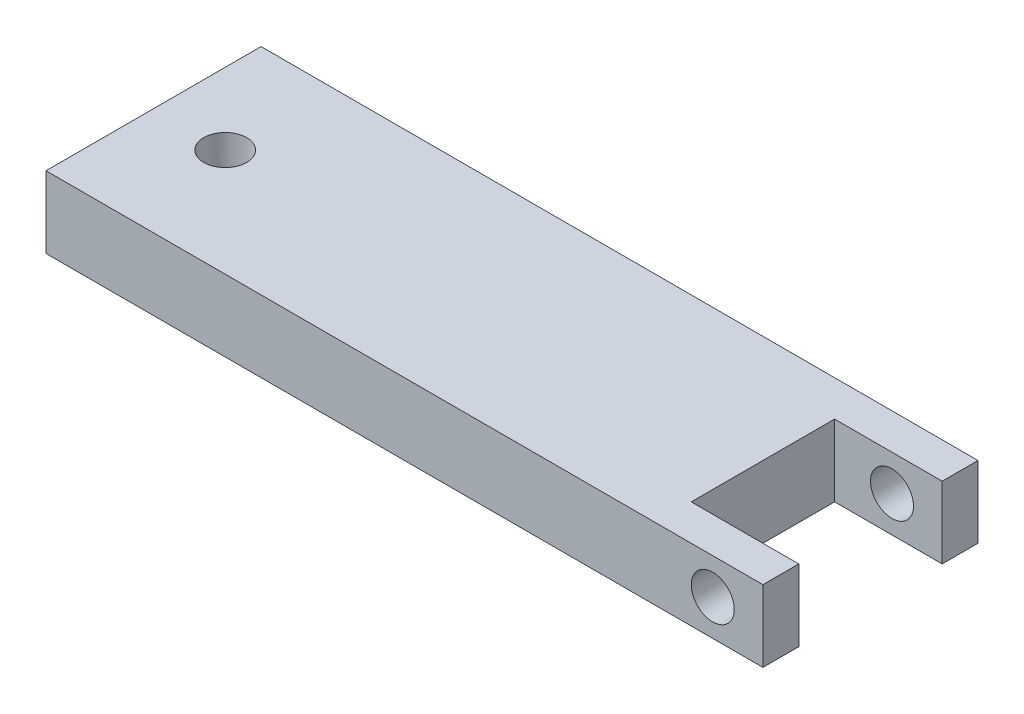
ISO-10303-21;
HEADER;
FILE_DESCRIPTION(('STEP AP214'),'2;1');
FILE_NAME('part.step','',(''),(''),'','','');
FILE_SCHEMA(('AUTOMOTIVE_DESIGN { 1 0 10303 214 1 1 1 1 }'));
ENDSEC;
DATA;
#1=APPLICATION_CONTEXT('core data for automotive mechanical design processes');
#2=APPLICATION_PROTOCOL_DEFINITION('international standard','automotive_design',2000,#1);
#3=PRODUCT_CONTEXT('',#1,'mechanical');
#4=PRODUCT('Part','Part','',(#3));
#5=PRODUCT_RELATED_PRODUCT_CATEGORY('part','',(#4));
#6=PRODUCT_DEFINITION_FORMATION('','',#4);
#7=PRODUCT_DEFINITION_CONTEXT('part definition',#1,'design');
#8=PRODUCT_DEFINITION('design','',#6,#7);
#9=PRODUCT_DEFINITION_SHAPE('','',#8);
#10=(LENGTH_UNIT() NAMED_UNIT(*) SI_UNIT(.MILLI.,.METRE.));
#11=(NAMED_UNIT(*) PLANE_ANGLE_UNIT() SI_UNIT($,.RADIAN.));
#12=(NAMED_UNIT(*) SI_UNIT($,.STERADIAN.) SOLID_ANGLE_UNIT());
#13=UNCERTAINTY_MEASURE_WITH_UNIT(LENGTH_MEASURE(1.E-05),#10,'distance_accuracy_value','');
#14=(GEOMETRIC_REPRESENTATION_CONTEXT(3) GLOBAL_UNCERTAINTY_ASSIGNED_CONTEXT((#13)) GLOBAL_UNIT_ASSIGNED_CONTEXT((#10,
#11,#12)) REPRESENTATION_CONTEXT('',''));
#15=CARTESIAN_POINT('',(0.,0.,0.));
#16=DIRECTION('',(0.,0.,1.));
#17=DIRECTION('',(1.,0.,0.));
#18=AXIS2_PLACEMENT_3D('',#15,#16,#17);
#19=CARTESIAN_POINT('',(50.,5.,0.));
#20=DIRECTION('',(-1.,0.,0.));
#21=DIRECTION('',(0.,0.,1.));
#22=AXIS2_PLACEMENT_3D('',#19,#20,#21);
#23=PLANE('',#22);
#24=DIRECTION('',(0.,0.,-1.));
#25=VECTOR('',#24,1.);
#26=CARTESIAN_POINT('',(50.,0.,0.));
#27=LINE('',#26,#25);
#28=CARTESIAN_POINT('',(50.,0.,0.));
#29=VERTEX_POINT('',#28);
#30=CARTESIAN_POINT('',(50.,0.,-2.5));
#31=VERTEX_POINT('',#30);
#32=EDGE_CURVE('E155',#29,#31,#27,.T.);
#33=ORIENTED_EDGE('',*,*,#32,.T.);
#34=DIRECTION('',(0.,-1.,0.));
#35=VECTOR('',#34,1.);
#36=CARTESIAN_POINT('',(50.,5.,-2.5));
#37=LINE('',#36,#35);
#38=CARTESIAN_POINT('',(50.,5.,-2.5));
#39=VERTEX_POINT('',#38);
#40=EDGE_CURVE('E170',#39,#31,#37,.T.);
#41=ORIENTED_EDGE('',*,*,#40,.F.);
#42=DIRECTION('',(0.,0.,-1.));
#43=VECTOR('',#42,1.);
#44=CARTESIAN_POINT('',(50.,5.,0.));
#45=LINE('',#44,#43);
#46=CARTESIAN_POINT('',(50.,5.,0.));
#47=VERTEX_POINT('',#46);
#48=EDGE_CURVE('E146',#47,#39,#45,.T.);
#49=ORIENTED_EDGE('',*,*,#48,.F.);
#50=DIRECTION('',(0.,-1.,0.));
#51=VECTOR('',#50,1.);
#52=CARTESIAN_POINT('',(50.,5.,0.));
#53=LINE('',#52,#51);
#54=EDGE_CURVE('E42',#47,#29,#53,.T.);
#55=ORIENTED_EDGE('',*,*,#54,.T.);
#56=EDGE_LOOP('',(#33,#41,#49,#55));
#57=FACE_BOUND('',#56,.T.);
#58=ADVANCED_FACE('F33',(#57),#23,.F.);
#59=CARTESIAN_POINT('',(0.,5.,0.));
#60=DIRECTION('',(1.,0.,0.));
#61=DIRECTION('',(0.,0.,-1.));
#62=AXIS2_PLACEMENT_3D('',#59,#60,#61);
#63=PLANE('',#62);
#64=DIRECTION('',(0.,0.,1.));
#65=VECTOR('',#64,1.);
#66=CARTESIAN_POINT('',(0.,0.,0.));
#67=LINE('',#66,#65);
#68=CARTESIAN_POINT('',(0.,0.,-15.));
#69=VERTEX_POINT('',#68);
#70=CARTESIAN_POINT('',(0.,0.,0.));
#71=VERTEX_POINT('',#70);
#72=EDGE_CURVE('E141',#69,#71,#67,.T.);
#73=ORIENTED_EDGE('',*,*,#72,.T.);
#74=DIRECTION('',(0.,-1.,0.));
#75=VECTOR('',#74,1.);
#76=CARTESIAN_POINT('',(0.,5.,0.));
#77=LINE('',#76,#75);
#78=CARTESIAN_POINT('',(0.,5.,0.));
#79=VERTEX_POINT('',#78);
#80=EDGE_CURVE('E11',#79,#71,#77,.T.);
#81=ORIENTED_EDGE('',*,*,#80,.F.);
#82=DIRECTION('',(0.,0.,1.));
#83=VECTOR('',#82,1.);
#84=CARTESIAN_POINT('',(0.,5.,0.));
#85=LINE('',#84,#83);
#86=CARTESIAN_POINT('',(0.,5.,-15.));
#87=VERTEX_POINT('',#86);
#88=EDGE_CURVE('E142',#87,#79,#85,.T.);
#89=ORIENTED_EDGE('',*,*,#88,.F.);
#90=DIRECTION('',(0.,-1.,0.));
#91=VECTOR('',#90,1.);
#92=CARTESIAN_POINT('',(0.,5.,-15.));
#93=LINE('',#92,#91);
#94=EDGE_CURVE('E150',#87,#69,#93,.T.);
#95=ORIENTED_EDGE('',*,*,#94,.T.);
#96=EDGE_LOOP('',(#73,#81,#89,#95));
#97=FACE_BOUND('',#96,.T.);
#98=ADVANCED_FACE('F35',(#97),#63,.F.);
#99=CARTESIAN_POINT('',(0.,5.,0.));
#100=DIRECTION('',(0.,0.,-1.));
#101=DIRECTION('',(-1.,0.,0.));
#102=AXIS2_PLACEMENT_3D('',#99,#100,#101);
#103=PLANE('',#102);
#104=CARTESIAN_POINT('',(46.5,2.5,0.));
#105=DIRECTION('',(0.,0.,-1.));
#106=DIRECTION('',(-1.,0.,0.));
#107=AXIS2_PLACEMENT_3D('',#104,#105,#106);
#108=CIRCLE('',#107,1.5);
#109=CARTESIAN_POINT('',(45.,2.5,0.));
#110=VERTEX_POINT('',#109);
#111=EDGE_CURVE('E184',#110,#110,#108,.T.);
#112=ORIENTED_EDGE('',*,*,#111,.T.);
#113=EDGE_LOOP('',(#112));
#114=FACE_BOUND('',#113,.T.);
#115=DIRECTION('',(1.,0.,0.));
#116=VECTOR('',#115,1.);
#117=CARTESIAN_POINT('',(0.,0.,0.));
#118=LINE('',#117,#116);
#119=EDGE_CURVE('E153',#71,#29,#118,.T.);
#120=ORIENTED_EDGE('',*,*,#119,.T.);
#121=ORIENTED_EDGE('',*,*,#54,.F.);
#122=DIRECTION('',(1.,0.,0.));
#123=VECTOR('',#122,1.);
#124=CARTESIAN_POINT('',(0.,5.,0.));
#125=LINE('',#124,#123);
#126=EDGE_CURVE('E86',#79,#47,#125,.T.);
#127=ORIENTED_EDGE('',*,*,#126,.F.);
#128=ORIENTED_EDGE('',*,*,#80,.T.);
#129=EDGE_LOOP('',(#120,#121,#127,#128));
#130=FACE_BOUND('',#129,.T.);
#131=ADVANCED_FACE('F209',(#114,#130),#103,.F.);
#132=CARTESIAN_POINT('',(50.,5.,-12.5));
#133=VERTEX_POINT('',#132);
#134=CARTESIAN_POINT('',(50.,5.,-15.));
#135=VERTEX_POINT('',#134);
#136=EDGE_CURVE('E145',#133,#135,#45,.T.);
#137=ORIENTED_EDGE('',*,*,#136,.F.);
#138=DIRECTION('',(0.,1.,0.));
#139=VECTOR('',#138,1.);
#140=CARTESIAN_POINT('',(50.,5.,-12.5));
#141=LINE('',#140,#139);
#142=CARTESIAN_POINT('',(50.,0.,-12.5));
#143=VERTEX_POINT('',#142);
#144=EDGE_CURVE('E172',#143,#133,#141,.T.);
#145=ORIENTED_EDGE('',*,*,#144,.F.);
#146=CARTESIAN_POINT('',(50.,0.,-15.));
#147=VERTEX_POINT('',#146);
#148=EDGE_CURVE('E127',#143,#147,#27,.T.);
#149=ORIENTED_EDGE('',*,*,#148,.T.);
#150=DIRECTION('',(0.,-1.,0.));
#151=VECTOR('',#150,1.);
#152=CARTESIAN_POINT('',(50.,5.,-15.));
#153=LINE('',#152,#151);
#154=EDGE_CURVE('E160',#135,#147,#153,.T.);
#155=ORIENTED_EDGE('',*,*,#154,.F.);
#156=EDGE_LOOP('',(#137,#145,#149,#155));
#157=FACE_BOUND('',#156,.T.);
#158=ADVANCED_FACE('F202',(#157),#23,.F.);
#159=CARTESIAN_POINT('',(0.,5.,-15.));
#160=DIRECTION('',(0.,0.,1.));
#161=DIRECTION('',(1.,0.,0.));
#162=AXIS2_PLACEMENT_3D('',#159,#160,#161);
#163=PLANE('',#162);
#164=CARTESIAN_POINT('',(46.5,2.5,-15.));
#165=DIRECTION('',(0.,0.,1.));
#166=DIRECTION('',(1.,0.,0.));
#167=AXIS2_PLACEMENT_3D('',#164,#165,#166);
#168=CIRCLE('',#167,1.5);
#169=CARTESIAN_POINT('',(48.,2.5,-15.));
#170=VERTEX_POINT('',#169);
#171=EDGE_CURVE('E173',#170,#170,#168,.T.);
#172=ORIENTED_EDGE('',*,*,#171,.T.);
#173=EDGE_LOOP('',(#172));
#174=FACE_BOUND('',#173,.T.);
#175=DIRECTION('',(-1.,0.,0.));
#176=VECTOR('',#175,1.);
#177=CARTESIAN_POINT('',(0.,0.,-15.));
#178=LINE('',#177,#176);
#179=EDGE_CURVE('E79',#147,#69,#178,.T.);
#180=ORIENTED_EDGE('',*,*,#179,.T.);
#181=ORIENTED_EDGE('',*,*,#94,.F.);
#182=DIRECTION('',(-1.,0.,0.));
#183=VECTOR('',#182,1.);
#184=CARTESIAN_POINT('',(0.,5.,-15.));
#185=LINE('',#184,#183);
#186=EDGE_CURVE('E58',#135,#87,#185,.T.);
#187=ORIENTED_EDGE('',*,*,#186,.F.);
#188=ORIENTED_EDGE('',*,*,#154,.T.);
#189=EDGE_LOOP('',(#180,#181,#187,#188));
#190=FACE_BOUND('',#189,.T.);
#191=ADVANCED_FACE('F199',(#174,#190),#163,.F.);
#192=CARTESIAN_POINT('',(0.,5.,0.));
#193=DIRECTION('',(0.,-1.,0.));
#194=DIRECTION('',(0.,0.,-1.));
#195=AXIS2_PLACEMENT_3D('',#192,#193,#194);
#196=PLANE('',#195);
#197=ORIENTED_EDGE('',*,*,#48,.T.);
#198=DIRECTION('',(1.,0.,0.));
#199=VECTOR('',#198,1.);
#200=CARTESIAN_POINT('',(42.5,5.,-2.5));
#201=LINE('',#200,#199);
#202=CARTESIAN_POINT('',(42.5,5.,-2.5));
#203=VERTEX_POINT('',#202);
#204=EDGE_CURVE('E130',#203,#39,#201,.T.);
#205=ORIENTED_EDGE('',*,*,#204,.F.);
#206=DIRECTION('',(0.,0.,1.));
#207=VECTOR('',#206,1.);
#208=CARTESIAN_POINT('',(42.5,5.,-2.5));
#209=LINE('',#208,#207);
#210=CARTESIAN_POINT('',(42.5,5.,-12.5));
#211=VERTEX_POINT('',#210);
#212=EDGE_CURVE('E116',#211,#203,#209,.T.);
#213=ORIENTED_EDGE('',*,*,#212,.F.);
#214=DIRECTION('',(1.,0.,0.));
#215=VECTOR('',#214,1.);
#216=CARTESIAN_POINT('',(42.5,5.,-12.5));
#217=LINE('',#216,#215);
#218=EDGE_CURVE('E114',#211,#133,#217,.T.);
#219=ORIENTED_EDGE('',*,*,#218,.T.);
#220=ORIENTED_EDGE('',*,*,#136,.T.);
#221=ORIENTED_EDGE('',*,*,#186,.T.);
#222=ORIENTED_EDGE('',*,*,#88,.T.);
#223=ORIENTED_EDGE('',*,*,#126,.T.);
#224=EDGE_LOOP('',(#197,#205,#213,#219,#220,#221,#222,#223));
#225=FACE_BOUND('',#224,.T.);
#226=CARTESIAN_POINT('',(5.,5.,-7.5));
#227=DIRECTION('',(0.,-1.,0.));
#228=DIRECTION('',(0.,0.,-1.));
#229=AXIS2_PLACEMENT_3D('',#226,#227,#228);
#230=CIRCLE('',#229,1.5);
#231=CARTESIAN_POINT('',(5.,5.,-9.));
#232=VERTEX_POINT('',#231);
#233=EDGE_CURVE('E138',#232,#232,#230,.T.);
#234=ORIENTED_EDGE('',*,*,#233,.T.);
#235=EDGE_LOOP('',(#234));
#236=FACE_BOUND('',#235,.T.);
#237=ADVANCED_FACE('F201',(#225,#236),#196,.F.);
#238=CARTESIAN_POINT('',(0.,0.,0.));
#239=DIRECTION('',(0.,-1.,0.));
#240=DIRECTION('',(0.,0.,-1.));
#241=AXIS2_PLACEMENT_3D('',#238,#239,#240);
#242=PLANE('',#241);
#243=DIRECTION('',(1.,0.,0.));
#244=VECTOR('',#243,1.);
#245=CARTESIAN_POINT('',(42.5,0.,-2.5));
#246=LINE('',#245,#244);
#247=CARTESIAN_POINT('',(42.5,0.,-2.5));
#248=VERTEX_POINT('',#247);
#249=EDGE_CURVE('E128',#248,#31,#246,.T.);
#250=ORIENTED_EDGE('',*,*,#249,.T.);
#251=ORIENTED_EDGE('',*,*,#32,.F.);
#252=ORIENTED_EDGE('',*,*,#119,.F.);
#253=ORIENTED_EDGE('',*,*,#72,.F.);
#254=ORIENTED_EDGE('',*,*,#179,.F.);
#255=ORIENTED_EDGE('',*,*,#148,.F.);
#256=DIRECTION('',(1.,0.,0.));
#257=VECTOR('',#256,1.);
#258=CARTESIAN_POINT('',(42.5,0.,-12.5));
#259=LINE('',#258,#257);
#260=CARTESIAN_POINT('',(42.5,0.,-12.5));
#261=VERTEX_POINT('',#260);
#262=EDGE_CURVE('E111',#261,#143,#259,.T.);
#263=ORIENTED_EDGE('',*,*,#262,.F.);
#264=DIRECTION('',(0.,0.,-1.));
#265=VECTOR('',#264,1.);
#266=CARTESIAN_POINT('',(42.5,0.,-2.5));
#267=LINE('',#266,#265);
#268=EDGE_CURVE('E117',#248,#261,#267,.T.);
#269=ORIENTED_EDGE('',*,*,#268,.F.);
#270=EDGE_LOOP('',(#250,#251,#252,#253,#254,#255,#263,#269));
#271=FACE_BOUND('',#270,.T.);
#272=CARTESIAN_POINT('',(5.,0.,-7.5));
#273=DIRECTION('',(0.,1.,0.));
#274=DIRECTION('',(0.,0.,1.));
#275=AXIS2_PLACEMENT_3D('',#272,#273,#274);
#276=CIRCLE('',#275,1.5);
#277=CARTESIAN_POINT('',(5.,0.,-6.));
#278=VERTEX_POINT('',#277);
#279=EDGE_CURVE('E135',#278,#278,#276,.T.);
#280=ORIENTED_EDGE('',*,*,#279,.T.);
#281=EDGE_LOOP('',(#280));
#282=FACE_BOUND('',#281,.T.);
#283=ADVANCED_FACE('F125',(#271,#282),#242,.T.);
#284=CARTESIAN_POINT('',(5.,0.,-7.5));
#285=DIRECTION('',(0.,1.,0.));
#286=DIRECTION('',(0.,0.,1.));
#287=AXIS2_PLACEMENT_3D('',#284,#285,#286);
#288=CYLINDRICAL_SURFACE('',#287,1.5);
#289=ORIENTED_EDGE('',*,*,#279,.F.);
#290=EDGE_LOOP('',(#289));
#291=FACE_BOUND('',#290,.T.);
#292=ORIENTED_EDGE('',*,*,#233,.F.);
#293=EDGE_LOOP('',(#292));
#294=FACE_BOUND('',#293,.T.);
#295=ADVANCED_FACE('F228',(#291,#294),#288,.F.);
#296=CARTESIAN_POINT('',(42.5,5.,-2.5));
#297=DIRECTION('',(0.,0.,1.));
#298=DIRECTION('',(0.,-1.,0.));
#299=AXIS2_PLACEMENT_3D('',#296,#297,#298);
#300=PLANE('',#299);
#301=CARTESIAN_POINT('',(46.5,2.5,-2.5));
#302=DIRECTION('',(0.,0.,1.));
#303=DIRECTION('',(0.,-1.,0.));
#304=AXIS2_PLACEMENT_3D('',#301,#302,#303);
#305=CIRCLE('',#304,1.5);
#306=CARTESIAN_POINT('',(46.5,1.,-2.5));
#307=VERTEX_POINT('',#306);
#308=EDGE_CURVE('E177',#307,#307,#305,.T.);
#309=ORIENTED_EDGE('',*,*,#308,.T.);
#310=EDGE_LOOP('',(#309));
#311=FACE_BOUND('',#310,.T.);
#312=ORIENTED_EDGE('',*,*,#40,.T.);
#313=ORIENTED_EDGE('',*,*,#249,.F.);
#314=DIRECTION('',(0.,-1.,0.));
#315=VECTOR('',#314,1.);
#316=CARTESIAN_POINT('',(42.5,5.,-2.5));
#317=LINE('',#316,#315);
#318=EDGE_CURVE('E49',#203,#248,#317,.T.);
#319=ORIENTED_EDGE('',*,*,#318,.F.);
#320=ORIENTED_EDGE('',*,*,#204,.T.);
#321=EDGE_LOOP('',(#312,#313,#319,#320));
#322=FACE_BOUND('',#321,.T.);
#323=ADVANCED_FACE('F169',(#311,#322),#300,.F.);
#324=CARTESIAN_POINT('',(42.5,5.,-12.5));
#325=DIRECTION('',(0.,0.,-1.));
#326=DIRECTION('',(0.,1.,0.));
#327=AXIS2_PLACEMENT_3D('',#324,#325,#326);
#328=PLANE('',#327);
#329=CARTESIAN_POINT('',(46.5,2.5,-12.5));
#330=DIRECTION('',(0.,0.,-1.));
#331=DIRECTION('',(0.,1.,0.));
#332=AXIS2_PLACEMENT_3D('',#329,#330,#331);
#333=CIRCLE('',#332,1.5);
#334=CARTESIAN_POINT('',(46.5,4.,-12.5));
#335=VERTEX_POINT('',#334);
#336=EDGE_CURVE('E37',#335,#335,#333,.T.);
#337=ORIENTED_EDGE('',*,*,#336,.T.);
#338=EDGE_LOOP('',(#337));
#339=FACE_BOUND('',#338,.T.);
#340=ORIENTED_EDGE('',*,*,#144,.T.);
#341=ORIENTED_EDGE('',*,*,#218,.F.);
#342=DIRECTION('',(0.,1.,0.));
#343=VECTOR('',#342,1.);
#344=CARTESIAN_POINT('',(42.5,5.,-12.5));
#345=LINE('',#344,#343);
#346=EDGE_CURVE('E108',#261,#211,#345,.T.);
#347=ORIENTED_EDGE('',*,*,#346,.F.);
#348=ORIENTED_EDGE('',*,*,#262,.T.);
#349=EDGE_LOOP('',(#340,#341,#347,#348));
#350=FACE_BOUND('',#349,.T.);
#351=ADVANCED_FACE('F109',(#339,#350),#328,.F.);
#352=CARTESIAN_POINT('',(42.5,0.,0.));
#353=DIRECTION('',(1.,0.,0.));
#354=DIRECTION('',(0.,0.,-1.));
#355=AXIS2_PLACEMENT_3D('',#352,#353,#354);
#356=PLANE('',#355);
#357=ORIENTED_EDGE('',*,*,#318,.T.);
#358=ORIENTED_EDGE('',*,*,#268,.T.);
#359=ORIENTED_EDGE('',*,*,#346,.T.);
#360=ORIENTED_EDGE('',*,*,#212,.T.);
#361=EDGE_LOOP('',(#357,#358,#359,#360));
#362=FACE_BOUND('',#361,.T.);
#363=ADVANCED_FACE('F120',(#362),#356,.T.);
#364=CARTESIAN_POINT('',(46.5,2.5,0.));
#365=DIRECTION('',(0.,0.,-1.));
#366=DIRECTION('',(-1.,0.,0.));
#367=AXIS2_PLACEMENT_3D('',#364,#365,#366);
#368=CYLINDRICAL_SURFACE('',#367,1.5);
#369=ORIENTED_EDGE('',*,*,#336,.F.);
#370=EDGE_LOOP('',(#369));
#371=FACE_BOUND('',#370,.T.);
#372=ORIENTED_EDGE('',*,*,#171,.F.);
#373=EDGE_LOOP('',(#372));
#374=FACE_BOUND('',#373,.T.);
#375=ADVANCED_FACE('F192',(#371,#374),#368,.F.);
#376=ORIENTED_EDGE('',*,*,#111,.F.);
#377=EDGE_LOOP('',(#376));
#378=FACE_BOUND('',#377,.T.);
#379=ORIENTED_EDGE('',*,*,#308,.F.);
#380=EDGE_LOOP('',(#379));
#381=FACE_BOUND('',#380,.T.);
#382=ADVANCED_FACE('F195',(#378,#381),#368,.F.);
#383=CLOSED_SHELL('',(#58,#98,#131,#158,#191,#237,#283,#295,#323,#351,#363,#375,#382));
#384=MANIFOLD_SOLID_BREP('B2',#383);
#385=ADVANCED_BREP_SHAPE_REPRESENTATION('',(#18,#384),#14);
#386=SHAPE_DEFINITION_REPRESENTATION(#9,#385);
ENDSEC;
END-ISO-10303-21;
